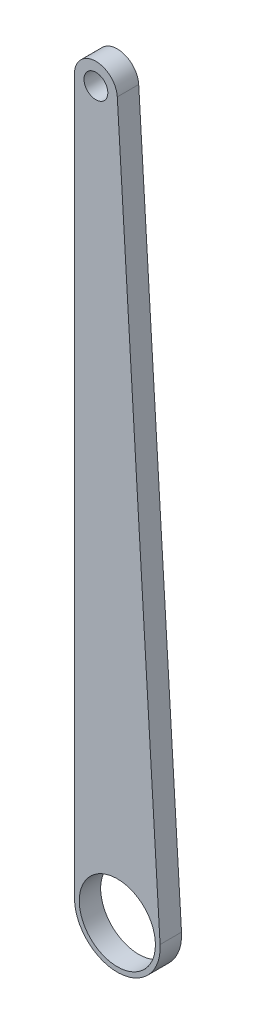
ISO-10303-21;
HEADER;
FILE_DESCRIPTION(('STEP AP214'),'2;1');
FILE_NAME('part.step','',(''),(''),'','','');
FILE_SCHEMA(('AUTOMOTIVE_DESIGN { 1 0 10303 214 1 1 1 1 }'));
ENDSEC;
DATA;
#1=APPLICATION_CONTEXT('core data for automotive mechanical design processes');
#2=APPLICATION_PROTOCOL_DEFINITION('international standard','automotive_design',2000,#1);
#3=PRODUCT_CONTEXT('',#1,'mechanical');
#4=PRODUCT('Part','Part','',(#3));
#5=PRODUCT_RELATED_PRODUCT_CATEGORY('part','',(#4));
#6=PRODUCT_DEFINITION_FORMATION('','',#4);
#7=PRODUCT_DEFINITION_CONTEXT('part definition',#1,'design');
#8=PRODUCT_DEFINITION('design','',#6,#7);
#9=PRODUCT_DEFINITION_SHAPE('','',#8);
#10=(LENGTH_UNIT() NAMED_UNIT(*) SI_UNIT(.MILLI.,.METRE.));
#11=(NAMED_UNIT(*) PLANE_ANGLE_UNIT() SI_UNIT($,.RADIAN.));
#12=(NAMED_UNIT(*) SI_UNIT($,.STERADIAN.) SOLID_ANGLE_UNIT());
#13=UNCERTAINTY_MEASURE_WITH_UNIT(LENGTH_MEASURE(1.E-05),#10,'distance_accuracy_value','');
#14=(GEOMETRIC_REPRESENTATION_CONTEXT(3) GLOBAL_UNCERTAINTY_ASSIGNED_CONTEXT((#13)) GLOBAL_UNIT_ASSIGNED_CONTEXT((#10,
#11,#12)) REPRESENTATION_CONTEXT('',''));
#15=CARTESIAN_POINT('',(0.,0.,0.));
#16=DIRECTION('',(0.,0.,1.));
#17=DIRECTION('',(1.,0.,0.));
#18=AXIS2_PLACEMENT_3D('',#15,#16,#17);
#19=CARTESIAN_POINT('',(-9.,0.,4.5));
#20=DIRECTION('',(-1.,0.,0.));
#21=DIRECTION('',(0.,0.,1.));
#22=AXIS2_PLACEMENT_3D('',#19,#20,#21);
#23=PLANE('',#22);
#24=DIRECTION('',(0.,1.,0.));
#25=VECTOR('',#24,1.);
#26=CARTESIAN_POINT('',(-9.,0.,0.));
#27=LINE('',#26,#25);
#28=CARTESIAN_POINT('',(-9.,0.,0.));
#29=VERTEX_POINT('',#28);
#30=CARTESIAN_POINT('',(-9.,150.,0.));
#31=VERTEX_POINT('',#30);
#32=EDGE_CURVE('E130',#29,#31,#27,.T.);
#33=ORIENTED_EDGE('',*,*,#32,.F.);
#34=DIRECTION('',(0.,0.,-1.));
#35=VECTOR('',#34,1.);
#36=CARTESIAN_POINT('',(-9.,0.,4.5));
#37=LINE('',#36,#35);
#38=CARTESIAN_POINT('',(-9.,0.,4.5));
#39=VERTEX_POINT('',#38);
#40=EDGE_CURVE('E88',#39,#29,#37,.T.);
#41=ORIENTED_EDGE('',*,*,#40,.F.);
#42=DIRECTION('',(0.,1.,0.));
#43=VECTOR('',#42,1.);
#44=CARTESIAN_POINT('',(-9.,0.,4.5));
#45=LINE('',#44,#43);
#46=CARTESIAN_POINT('',(-9.,150.,4.5));
#47=VERTEX_POINT('',#46);
#48=EDGE_CURVE('E128',#39,#47,#45,.T.);
#49=ORIENTED_EDGE('',*,*,#48,.T.);
#50=DIRECTION('',(0.,0.,-1.));
#51=VECTOR('',#50,1.);
#52=CARTESIAN_POINT('',(-9.,150.,4.5));
#53=LINE('',#52,#51);
#54=EDGE_CURVE('E12',#47,#31,#53,.T.);
#55=ORIENTED_EDGE('',*,*,#54,.T.);
#56=EDGE_LOOP('',(#33,#41,#49,#55));
#57=FACE_BOUND('',#56,.T.);
#58=ADVANCED_FACE('F77',(#57),#23,.T.);
#59=CARTESIAN_POINT('',(8.9838145668898,0.539514437006694,4.5));
#60=DIRECTION('',(-0.998201618543311,-0.0599460485562993,0.));
#61=DIRECTION('',(0.0599460485562993,-0.998201618543311,0.));
#62=AXIS2_PLACEMENT_3D('',#59,#60,#61);
#63=PLANE('',#62);
#64=DIRECTION('',(-0.0599460485562993,0.998201618543311,0.));
#65=VECTOR('',#64,1.);
#66=CARTESIAN_POINT('',(8.9838145668898,0.539514437006694,0.));
#67=LINE('',#66,#65);
#68=CARTESIAN_POINT('',(8.9838145668898,0.539514437006694,0.));
#69=VERTEX_POINT('',#68);
#70=CARTESIAN_POINT('',(-0.00809271655510292,150.269757218503,0.));
#71=VERTEX_POINT('',#70);
#72=EDGE_CURVE('E159',#69,#71,#67,.T.);
#73=ORIENTED_EDGE('',*,*,#72,.T.);
#74=DIRECTION('',(0.,0.,-1.));
#75=VECTOR('',#74,1.);
#76=CARTESIAN_POINT('',(-0.00809271655510292,150.269757218503,4.5));
#77=LINE('',#76,#75);
#78=CARTESIAN_POINT('',(-0.00809271655510292,150.269757218503,4.5));
#79=VERTEX_POINT('',#78);
#80=EDGE_CURVE('E119',#79,#71,#77,.T.);
#81=ORIENTED_EDGE('',*,*,#80,.F.);
#82=DIRECTION('',(-0.0599460485562993,0.998201618543311,0.));
#83=VECTOR('',#82,1.);
#84=CARTESIAN_POINT('',(8.9838145668898,0.539514437006694,4.5));
#85=LINE('',#84,#83);
#86=CARTESIAN_POINT('',(8.9838145668898,0.539514437006694,4.5));
#87=VERTEX_POINT('',#86);
#88=EDGE_CURVE('E97',#87,#79,#85,.T.);
#89=ORIENTED_EDGE('',*,*,#88,.F.);
#90=DIRECTION('',(0.,0.,-1.));
#91=VECTOR('',#90,1.);
#92=CARTESIAN_POINT('',(8.9838145668898,0.539514437006694,4.5));
#93=LINE('',#92,#91);
#94=EDGE_CURVE('E112',#87,#69,#93,.T.);
#95=ORIENTED_EDGE('',*,*,#94,.T.);
#96=EDGE_LOOP('',(#73,#81,#89,#95));
#97=FACE_BOUND('',#96,.T.);
#98=ADVANCED_FACE('F188',(#97),#63,.F.);
#99=CARTESIAN_POINT('',(-4.5,150.,4.5));
#100=DIRECTION('',(0.,0.,-1.));
#101=DIRECTION('',(-1.,0.,0.));
#102=AXIS2_PLACEMENT_3D('',#99,#100,#101);
#103=CYLINDRICAL_SURFACE('',#102,4.5);
#104=CARTESIAN_POINT('',(-4.5,150.,0.));
#105=DIRECTION('',(0.,0.,1.));
#106=DIRECTION('',(1.,0.,0.));
#107=AXIS2_PLACEMENT_3D('',#104,#105,#106);
#108=CIRCLE('',#107,4.5);
#109=EDGE_CURVE('E153',#31,#71,#108,.F.);
#110=ORIENTED_EDGE('',*,*,#109,.F.);
#111=ORIENTED_EDGE('',*,*,#54,.F.);
#112=CARTESIAN_POINT('',(-4.5,150.,4.5));
#113=DIRECTION('',(0.,0.,1.));
#114=DIRECTION('',(1.,0.,0.));
#115=AXIS2_PLACEMENT_3D('',#112,#113,#114);
#116=CIRCLE('',#115,4.5);
#117=EDGE_CURVE('E140',#47,#79,#116,.F.);
#118=ORIENTED_EDGE('',*,*,#117,.T.);
#119=ORIENTED_EDGE('',*,*,#80,.T.);
#120=EDGE_LOOP('',(#110,#111,#118,#119));
#121=FACE_BOUND('',#120,.T.);
#122=ADVANCED_FACE('F193',(#121),#103,.T.);
#123=CARTESIAN_POINT('',(-4.5,150.,4.5));
#124=DIRECTION('',(0.,0.,-1.));
#125=DIRECTION('',(-1.,0.,0.));
#126=AXIS2_PLACEMENT_3D('',#123,#124,#125);
#127=CYLINDRICAL_SURFACE('',#126,2.5);
#128=CARTESIAN_POINT('',(-4.5,150.,4.5));
#129=DIRECTION('',(0.,0.,1.));
#130=DIRECTION('',(1.,0.,0.));
#131=AXIS2_PLACEMENT_3D('',#128,#129,#130);
#132=CIRCLE('',#131,2.5);
#133=CARTESIAN_POINT('',(-2.,150.,4.5));
#134=VERTEX_POINT('',#133);
#135=EDGE_CURVE('E146',#134,#134,#132,.T.);
#136=ORIENTED_EDGE('',*,*,#135,.T.);
#137=EDGE_LOOP('',(#136));
#138=FACE_BOUND('',#137,.T.);
#139=CARTESIAN_POINT('',(-4.5,150.,0.));
#140=DIRECTION('',(0.,0.,1.));
#141=DIRECTION('',(1.,0.,0.));
#142=AXIS2_PLACEMENT_3D('',#139,#140,#141);
#143=CIRCLE('',#142,2.5);
#144=CARTESIAN_POINT('',(-2.,150.,0.));
#145=VERTEX_POINT('',#144);
#146=EDGE_CURVE('E137',#145,#145,#143,.T.);
#147=ORIENTED_EDGE('',*,*,#146,.F.);
#148=EDGE_LOOP('',(#147));
#149=FACE_BOUND('',#148,.T.);
#150=ADVANCED_FACE('F198',(#138,#149),#127,.F.);
#151=CARTESIAN_POINT('',(0.,0.,0.));
#152=DIRECTION('',(0.,0.,1.));
#153=DIRECTION('',(1.,0.,0.));
#154=AXIS2_PLACEMENT_3D('',#151,#152,#153);
#155=PLANE('',#154);
#156=ORIENTED_EDGE('',*,*,#146,.T.);
#157=EDGE_LOOP('',(#156));
#158=FACE_BOUND('',#157,.T.);
#159=ORIENTED_EDGE('',*,*,#109,.T.);
#160=ORIENTED_EDGE('',*,*,#72,.F.);
#161=CARTESIAN_POINT('',(0.,0.,0.));
#162=DIRECTION('',(0.,0.,1.));
#163=DIRECTION('',(1.,0.,0.));
#164=AXIS2_PLACEMENT_3D('',#161,#162,#163);
#165=CIRCLE('',#164,9.);
#166=EDGE_CURVE('E81',#29,#69,#165,.T.);
#167=ORIENTED_EDGE('',*,*,#166,.F.);
#168=ORIENTED_EDGE('',*,*,#32,.T.);
#169=EDGE_LOOP('',(#159,#160,#167,#168));
#170=FACE_BOUND('',#169,.T.);
#171=CARTESIAN_POINT('',(0.,0.,0.));
#172=DIRECTION('',(0.,0.,1.));
#173=DIRECTION('',(1.,0.,0.));
#174=AXIS2_PLACEMENT_3D('',#171,#172,#173);
#175=CIRCLE('',#174,8.);
#176=CARTESIAN_POINT('',(8.,0.,0.));
#177=VERTEX_POINT('',#176);
#178=EDGE_CURVE('E170',#177,#177,#175,.T.);
#179=ORIENTED_EDGE('',*,*,#178,.T.);
#180=EDGE_LOOP('',(#179));
#181=FACE_BOUND('',#180,.T.);
#182=ADVANCED_FACE('F175',(#158,#170,#181),#155,.F.);
#183=CARTESIAN_POINT('',(0.,0.,4.5));
#184=DIRECTION('',(0.,0.,1.));
#185=DIRECTION('',(1.,0.,0.));
#186=AXIS2_PLACEMENT_3D('',#183,#184,#185);
#187=PLANE('',#186);
#188=ORIENTED_EDGE('',*,*,#135,.F.);
#189=EDGE_LOOP('',(#188));
#190=FACE_BOUND('',#189,.T.);
#191=ORIENTED_EDGE('',*,*,#117,.F.);
#192=ORIENTED_EDGE('',*,*,#48,.F.);
#193=CARTESIAN_POINT('',(0.,0.,4.5));
#194=DIRECTION('',(0.,0.,1.));
#195=DIRECTION('',(1.,0.,0.));
#196=AXIS2_PLACEMENT_3D('',#193,#194,#195);
#197=CIRCLE('',#196,9.);
#198=EDGE_CURVE('E135',#39,#87,#197,.T.);
#199=ORIENTED_EDGE('',*,*,#198,.T.);
#200=ORIENTED_EDGE('',*,*,#88,.T.);
#201=EDGE_LOOP('',(#191,#192,#199,#200));
#202=FACE_BOUND('',#201,.T.);
#203=CARTESIAN_POINT('',(0.,0.,4.5));
#204=DIRECTION('',(0.,0.,1.));
#205=DIRECTION('',(1.,0.,0.));
#206=AXIS2_PLACEMENT_3D('',#203,#204,#205);
#207=CIRCLE('',#206,8.);
#208=CARTESIAN_POINT('',(8.,0.,4.5));
#209=VERTEX_POINT('',#208);
#210=EDGE_CURVE('E166',#209,#209,#207,.T.);
#211=ORIENTED_EDGE('',*,*,#210,.F.);
#212=EDGE_LOOP('',(#211));
#213=FACE_BOUND('',#212,.T.);
#214=ADVANCED_FACE('F138',(#190,#202,#213),#187,.T.);
#215=CARTESIAN_POINT('',(0.,0.,4.5));
#216=DIRECTION('',(0.,0.,-1.));
#217=DIRECTION('',(-1.,0.,0.));
#218=AXIS2_PLACEMENT_3D('',#215,#216,#217);
#219=CYLINDRICAL_SURFACE('',#218,8.);
#220=ORIENTED_EDGE('',*,*,#210,.T.);
#221=EDGE_LOOP('',(#220));
#222=FACE_BOUND('',#221,.T.);
#223=ORIENTED_EDGE('',*,*,#178,.F.);
#224=EDGE_LOOP('',(#223));
#225=FACE_BOUND('',#224,.T.);
#226=ADVANCED_FACE('F177',(#222,#225),#219,.F.);
#227=CARTESIAN_POINT('',(0.,0.,4.5));
#228=DIRECTION('',(0.,0.,-1.));
#229=DIRECTION('',(-1.,0.,0.));
#230=AXIS2_PLACEMENT_3D('',#227,#228,#229);
#231=CYLINDRICAL_SURFACE('',#230,9.);
#232=ORIENTED_EDGE('',*,*,#40,.T.);
#233=ORIENTED_EDGE('',*,*,#166,.T.);
#234=ORIENTED_EDGE('',*,*,#94,.F.);
#235=ORIENTED_EDGE('',*,*,#198,.F.);
#236=EDGE_LOOP('',(#232,#233,#234,#235));
#237=FACE_BOUND('',#236,.T.);
#238=ADVANCED_FACE('F79',(#237),#231,.T.);
#239=CLOSED_SHELL('',(#58,#98,#122,#150,#182,#214,#226,#238));
#240=MANIFOLD_SOLID_BREP('B2',#239);
#241=ADVANCED_BREP_SHAPE_REPRESENTATION('',(#18,#240),#14);
#242=SHAPE_DEFINITION_REPRESENTATION(#9,#241);
ENDSEC;
END-ISO-10303-21;
